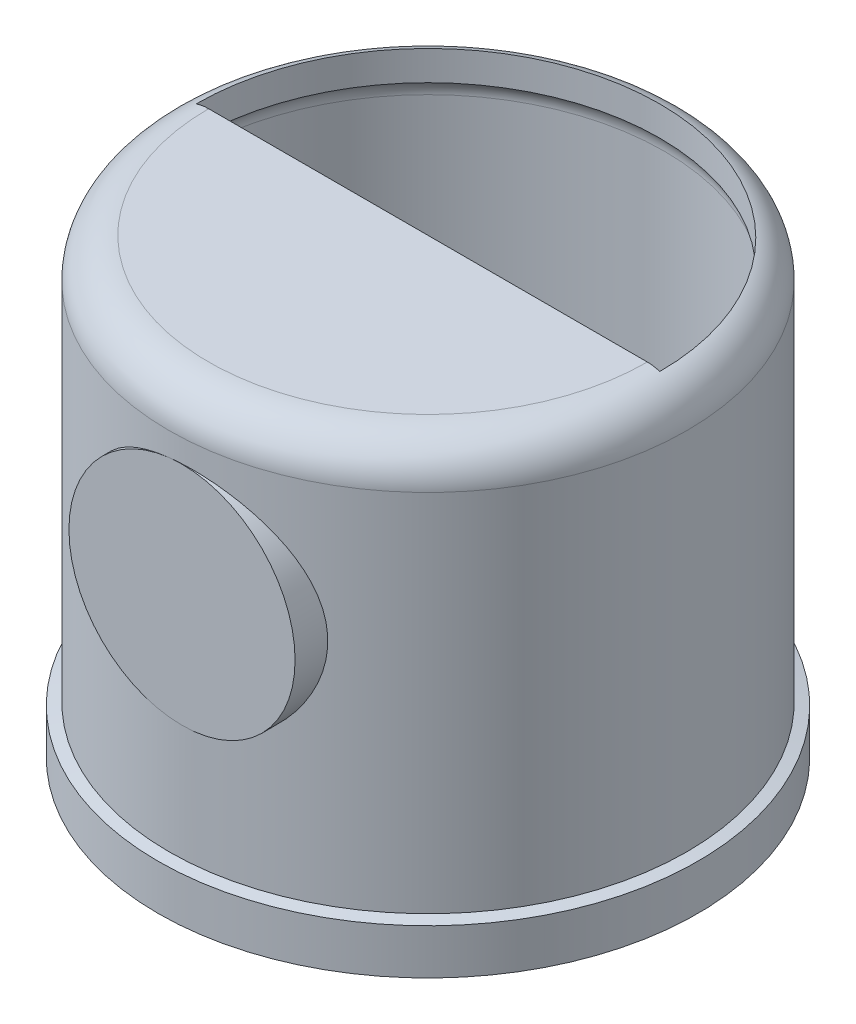
ISO-10303-21;
HEADER;
FILE_DESCRIPTION(('STEP AP214'),'2;1');
FILE_NAME('part.step','',(''),(''),'','','');
FILE_SCHEMA(('AUTOMOTIVE_DESIGN { 1 0 10303 214 1 1 1 1 }'));
ENDSEC;
DATA;
#1=APPLICATION_CONTEXT('core data for automotive mechanical design processes');
#2=APPLICATION_PROTOCOL_DEFINITION('international standard','automotive_design',2000,#1);
#3=PRODUCT_CONTEXT('',#1,'mechanical');
#4=PRODUCT('Part','Part','',(#3));
#5=PRODUCT_RELATED_PRODUCT_CATEGORY('part','',(#4));
#6=PRODUCT_DEFINITION_FORMATION('','',#4);
#7=PRODUCT_DEFINITION_CONTEXT('part definition',#1,'design');
#8=PRODUCT_DEFINITION('design','',#6,#7);
#9=PRODUCT_DEFINITION_SHAPE('','',#8);
#10=(LENGTH_UNIT() NAMED_UNIT(*) SI_UNIT(.MILLI.,.METRE.));
#11=(NAMED_UNIT(*) PLANE_ANGLE_UNIT() SI_UNIT($,.RADIAN.));
#12=(NAMED_UNIT(*) SI_UNIT($,.STERADIAN.) SOLID_ANGLE_UNIT());
#13=UNCERTAINTY_MEASURE_WITH_UNIT(LENGTH_MEASURE(1.E-05),#10,'distance_accuracy_value','');
#14=(GEOMETRIC_REPRESENTATION_CONTEXT(3) GLOBAL_UNCERTAINTY_ASSIGNED_CONTEXT((#13)) GLOBAL_UNIT_ASSIGNED_CONTEXT((#10,
#11,#12)) REPRESENTATION_CONTEXT('',''));
#15=CARTESIAN_POINT('',(0.,0.,0.));
#16=DIRECTION('',(0.,0.,1.));
#17=DIRECTION('',(1.,0.,0.));
#18=AXIS2_PLACEMENT_3D('',#15,#16,#17);
#19=CARTESIAN_POINT('',(0.,36.5,0.));
#20=DIRECTION('',(0.,-1.,0.));
#21=DIRECTION('',(0.,0.,-1.));
#22=AXIS2_PLACEMENT_3D('',#19,#20,#21);
#23=TOROIDAL_SURFACE('',#22,19.4,3.5);
#24=CARTESIAN_POINT('',(-19.4,36.5,0.));
#25=DIRECTION('',(0.,0.,1.));
#26=DIRECTION('',(1.,0.,0.));
#27=AXIS2_PLACEMENT_3D('',#24,#25,#26);
#28=CIRCLE('',#27,3.5);
#29=CARTESIAN_POINT('',(-20.5,39.8226495451672,0.));
#30=VERTEX_POINT('',#29);
#31=CARTESIAN_POINT('',(-19.4,40.,0.));
#32=VERTEX_POINT('',#31);
#33=EDGE_CURVE('E55',#30,#32,#28,.F.);
#34=ORIENTED_EDGE('',*,*,#33,.F.);
#35=CARTESIAN_POINT('',(0.,39.8226495451672,0.));
#36=DIRECTION('',(0.,-1.,0.));
#37=DIRECTION('',(0.,0.,-1.));
#38=AXIS2_PLACEMENT_3D('',#35,#36,#37);
#39=CIRCLE('',#38,20.5);
#40=CARTESIAN_POINT('',(20.5,39.8226495451672,0.));
#41=VERTEX_POINT('',#40);
#42=EDGE_CURVE('E112',#41,#30,#39,.F.);
#43=ORIENTED_EDGE('',*,*,#42,.F.);
#44=CARTESIAN_POINT('',(19.4,36.5,0.));
#45=DIRECTION('',(0.,0.,1.));
#46=DIRECTION('',(1.,0.,0.));
#47=AXIS2_PLACEMENT_3D('',#44,#45,#46);
#48=CIRCLE('',#47,3.5);
#49=CARTESIAN_POINT('',(19.4,40.,0.));
#50=VERTEX_POINT('',#49);
#51=EDGE_CURVE('E100',#50,#41,#48,.F.);
#52=ORIENTED_EDGE('',*,*,#51,.F.);
#53=CARTESIAN_POINT('',(0.,40.,0.));
#54=DIRECTION('',(0.,-1.,0.));
#55=DIRECTION('',(0.,0.,-1.));
#56=AXIS2_PLACEMENT_3D('',#53,#54,#55);
#57=CIRCLE('',#56,19.4);
#58=EDGE_CURVE('E111',#50,#32,#57,.T.);
#59=ORIENTED_EDGE('',*,*,#58,.T.);
#60=EDGE_LOOP('',(#34,#43,#52,#59));
#61=FACE_BOUND('',#60,.T.);
#62=CARTESIAN_POINT('',(0.,36.5,0.));
#63=DIRECTION('',(0.,-1.,0.));
#64=DIRECTION('',(0.,0.,-1.));
#65=AXIS2_PLACEMENT_3D('',#62,#63,#64);
#66=CIRCLE('',#65,22.9);
#67=CARTESIAN_POINT('',(0.,36.5,-22.9));
#68=VERTEX_POINT('',#67);
#69=EDGE_CURVE('E166',#68,#68,#66,.T.);
#70=ORIENTED_EDGE('',*,*,#69,.F.);
#71=EDGE_LOOP('',(#70));
#72=FACE_BOUND('',#71,.T.);
#73=ADVANCED_FACE('F40',(#61,#72),#23,.T.);
#74=CARTESIAN_POINT('',(19.4,40.,0.));
#75=DIRECTION('',(0.,1.,0.));
#76=DIRECTION('',(0.,0.,1.));
#77=AXIS2_PLACEMENT_3D('',#74,#75,#76);
#78=PLANE('',#77);
#79=DIRECTION('',(1.,0.,0.));
#80=VECTOR('',#79,1.);
#81=CARTESIAN_POINT('',(-20.5,40.,0.));
#82=LINE('',#81,#80);
#83=EDGE_CURVE('E97',#32,#50,#82,.T.);
#84=ORIENTED_EDGE('',*,*,#83,.F.);
#85=ORIENTED_EDGE('',*,*,#58,.F.);
#86=EDGE_LOOP('',(#84,#85));
#87=FACE_BOUND('',#86,.T.);
#88=ADVANCED_FACE('F116',(#87),#78,.T.);
#89=CARTESIAN_POINT('',(20.9,11.9081781359912,0.));
#90=DIRECTION('',(0.,-1.,0.));
#91=DIRECTION('',(0.,0.,-1.));
#92=AXIS2_PLACEMENT_3D('',#89,#90,#91);
#93=PLANE('',#92);
#94=CARTESIAN_POINT('',(0.,11.9081781359912,0.));
#95=DIRECTION('',(0.,-1.,0.));
#96=DIRECTION('',(0.,0.,-1.));
#97=AXIS2_PLACEMENT_3D('',#94,#95,#96);
#98=CIRCLE('',#97,20.5);
#99=CARTESIAN_POINT('',(-20.5,11.9081781359912,0.));
#100=VERTEX_POINT('',#99);
#101=CARTESIAN_POINT('',(20.5,11.9081781359912,0.));
#102=VERTEX_POINT('',#101);
#103=EDGE_CURVE('E254',#100,#102,#98,.T.);
#104=ORIENTED_EDGE('',*,*,#103,.F.);
#105=DIRECTION('',(-1.,0.,0.));
#106=VECTOR('',#105,1.);
#107=CARTESIAN_POINT('',(20.9,11.9081781359912,0.));
#108=LINE('',#107,#106);
#109=EDGE_CURVE('E114',#102,#100,#108,.T.);
#110=ORIENTED_EDGE('',*,*,#109,.F.);
#111=EDGE_LOOP('',(#104,#110));
#112=FACE_BOUND('',#111,.T.);
#113=CARTESIAN_POINT('',(0.,11.9081781359912,0.));
#114=DIRECTION('',(0.,-1.,0.));
#115=DIRECTION('',(0.,0.,-1.));
#116=AXIS2_PLACEMENT_3D('',#113,#114,#115);
#117=CIRCLE('',#116,20.9);
#118=CARTESIAN_POINT('',(0.,11.9081781359912,-20.9));
#119=VERTEX_POINT('',#118);
#120=EDGE_CURVE('E186',#119,#119,#117,.T.);
#121=ORIENTED_EDGE('',*,*,#120,.T.);
#122=EDGE_LOOP('',(#121));
#123=FACE_BOUND('',#122,.T.);
#124=ADVANCED_FACE('F215',(#112,#123),#93,.T.);
#125=CARTESIAN_POINT('',(0.,-0.724089275479442,0.));
#126=DIRECTION('',(0.,-1.,0.));
#127=DIRECTION('',(0.,0.,-1.));
#128=AXIS2_PLACEMENT_3D('',#125,#126,#127);
#129=CYLINDRICAL_SURFACE('',#128,20.9);
#130=CARTESIAN_POINT('',(0.,0.,0.));
#131=DIRECTION('',(0.,-1.,0.));
#132=DIRECTION('',(0.,0.,-1.));
#133=AXIS2_PLACEMENT_3D('',#130,#131,#132);
#134=CIRCLE('',#133,20.9);
#135=CARTESIAN_POINT('',(0.,0.,-20.9));
#136=VERTEX_POINT('',#135);
#137=EDGE_CURVE('E182',#136,#136,#134,.T.);
#138=ORIENTED_EDGE('',*,*,#137,.T.);
#139=EDGE_LOOP('',(#138));
#140=FACE_BOUND('',#139,.T.);
#141=ORIENTED_EDGE('',*,*,#120,.F.);
#142=EDGE_LOOP('',(#141));
#143=FACE_BOUND('',#142,.T.);
#144=ADVANCED_FACE('F219',(#140,#143),#129,.F.);
#145=CARTESIAN_POINT('',(20.9,0.,0.));
#146=DIRECTION('',(0.,-1.,0.));
#147=DIRECTION('',(0.,0.,-1.));
#148=AXIS2_PLACEMENT_3D('',#145,#146,#147);
#149=PLANE('',#148);
#150=CARTESIAN_POINT('',(0.,0.,0.));
#151=DIRECTION('',(0.,-1.,0.));
#152=DIRECTION('',(0.,0.,-1.));
#153=AXIS2_PLACEMENT_3D('',#150,#151,#152);
#154=CIRCLE('',#153,23.8715918375041);
#155=CARTESIAN_POINT('',(0.,0.,-23.8715918375041));
#156=VERTEX_POINT('',#155);
#157=EDGE_CURVE('E178',#156,#156,#154,.T.);
#158=ORIENTED_EDGE('',*,*,#157,.T.);
#159=EDGE_LOOP('',(#158));
#160=FACE_BOUND('',#159,.T.);
#161=ORIENTED_EDGE('',*,*,#137,.F.);
#162=EDGE_LOOP('',(#161));
#163=FACE_BOUND('',#162,.T.);
#164=ADVANCED_FACE('F297',(#160,#163),#149,.T.);
#165=CARTESIAN_POINT('',(0.,-0.724089275479442,0.));
#166=DIRECTION('',(0.,-1.,0.));
#167=DIRECTION('',(0.,0.,-1.));
#168=AXIS2_PLACEMENT_3D('',#165,#166,#167);
#169=CYLINDRICAL_SURFACE('',#168,23.8715918375041);
#170=CARTESIAN_POINT('',(0.,4.,0.));
#171=DIRECTION('',(0.,-1.,0.));
#172=DIRECTION('',(0.,0.,-1.));
#173=AXIS2_PLACEMENT_3D('',#170,#171,#172);
#174=CIRCLE('',#173,23.8715918375041);
#175=CARTESIAN_POINT('',(0.,4.,-23.8715918375041));
#176=VERTEX_POINT('',#175);
#177=EDGE_CURVE('E174',#176,#176,#174,.T.);
#178=ORIENTED_EDGE('',*,*,#177,.T.);
#179=EDGE_LOOP('',(#178));
#180=FACE_BOUND('',#179,.T.);
#181=ORIENTED_EDGE('',*,*,#157,.F.);
#182=EDGE_LOOP('',(#181));
#183=FACE_BOUND('',#182,.T.);
#184=ADVANCED_FACE('F292',(#180,#183),#169,.T.);
#185=CARTESIAN_POINT('',(0.,4.,0.));
#186=DIRECTION('',(0.,-1.,0.));
#187=DIRECTION('',(0.,0.,-1.));
#188=AXIS2_PLACEMENT_3D('',#185,#186,#187);
#189=CONICAL_SURFACE('',#188,23.8715918375041,1.33186665186768);
#190=CARTESIAN_POINT('',(0.,4.23666284308145,0.));
#191=DIRECTION('',(0.,-1.,0.));
#192=DIRECTION('',(0.,0.,-1.));
#193=AXIS2_PLACEMENT_3D('',#190,#191,#192);
#194=CIRCLE('',#193,22.9);
#195=CARTESIAN_POINT('',(0.,4.23666284308145,-22.9));
#196=VERTEX_POINT('',#195);
#197=EDGE_CURVE('E170',#196,#196,#194,.T.);
#198=ORIENTED_EDGE('',*,*,#197,.T.);
#199=EDGE_LOOP('',(#198));
#200=FACE_BOUND('',#199,.T.);
#201=ORIENTED_EDGE('',*,*,#177,.F.);
#202=EDGE_LOOP('',(#201));
#203=FACE_BOUND('',#202,.T.);
#204=ADVANCED_FACE('F288',(#200,#203),#189,.T.);
#205=CARTESIAN_POINT('',(0.,-0.724089275479442,0.));
#206=DIRECTION('',(0.,-1.,0.));
#207=DIRECTION('',(0.,0.,-1.));
#208=AXIS2_PLACEMENT_3D('',#205,#206,#207);
#209=CYLINDRICAL_SURFACE('',#208,22.9);
#210=CARTESIAN_POINT('',(11.1446298645785,24.5,20.0051799587393));
#211=CARTESIAN_POINT('',(11.1446277445211,24.7609901690464,20.0051824052752));
#212=CARTESIAN_POINT('',(11.1343963456302,25.0220630439062,20.0108915552293));
#213=CARTESIAN_POINT('',(11.0935934936793,25.54223924978,20.0335396146365));
#214=CARTESIAN_POINT('',(11.0630091209592,25.8013412239737,20.0504856570194));
#215=CARTESIAN_POINT('',(10.9818099909218,26.3160092112228,20.095073877167));
#216=CARTESIAN_POINT('',(10.9311536647032,26.5715667396853,20.1227382498763));
#217=CARTESIAN_POINT('',(10.8104070159934,27.0768725375808,20.1878625789932));
#218=CARTESIAN_POINT('',(10.7403082246235,27.326618223952,20.2253268036801));
#219=CARTESIAN_POINT('',(10.5819026423815,27.817222025643,20.3086505994999));
#220=CARTESIAN_POINT('',(10.493700069966,28.0581220970861,20.3544619561206));
#221=CARTESIAN_POINT('',(10.2996504177269,28.5312537147744,20.4533384685586));
#222=CARTESIAN_POINT('',(10.1937969504418,28.7634820855556,20.5064062490565));
#223=CARTESIAN_POINT('',(9.96537628941012,29.2179538313331,20.6183762342079));
#224=CARTESIAN_POINT('',(9.84281639879485,29.4402015132112,20.6772758864257));
#225=CARTESIAN_POINT('',(9.58179133663133,29.8738592149634,20.7995202088162));
#226=CARTESIAN_POINT('',(9.44332571992444,30.0852689312722,20.8628650033773));
#227=CARTESIAN_POINT('',(9.14016333292685,30.512078171252,20.9975468640248));
#228=CARTESIAN_POINT('',(8.97427161574757,30.7265534903059,21.0691250928046));
#229=CARTESIAN_POINT('',(8.62602631717368,31.1409291354725,21.2140809431241));
#230=CARTESIAN_POINT('',(8.44367688198169,31.3408331097395,21.2874581080826));
#231=CARTESIAN_POINT('',(8.06331262976379,31.7253021039391,21.4344250115112));
#232=CARTESIAN_POINT('',(7.86528878253018,31.9098581543593,21.5080148486363));
#233=CARTESIAN_POINT('',(7.45460216451242,32.262572437536,21.6537847126987));
#234=CARTESIAN_POINT('',(7.24193721877425,32.4307282250072,21.7259645281222));
#235=CARTESIAN_POINT('',(6.78673678556612,32.761447485421,21.8726202445706));
#236=CARTESIAN_POINT('',(6.54315547874084,32.922675406883,21.9468705518435));
#237=CARTESIAN_POINT('',(6.04177866022837,33.2237262116359,22.0901528799861));
#238=CARTESIAN_POINT('',(5.78398882520473,33.3635575602768,22.1591869591063));
#239=CARTESIAN_POINT('',(5.25570003325066,33.6206018607526,22.2903942528852));
#240=CARTESIAN_POINT('',(4.98520194493891,33.7378163556778,22.3525679354873));
#241=CARTESIAN_POINT('',(4.43333132777802,33.9483672767324,22.4685345832508));
#242=CARTESIAN_POINT('',(4.15195966145207,34.0417055923316,22.5223282114458));
#243=CARTESIAN_POINT('',(3.59490182219484,34.1992613183523,22.6177465632866));
#244=CARTESIAN_POINT('',(3.31964605817942,34.2647112622682,22.659848617038));
#245=CARTESIAN_POINT('',(2.76330401954821,34.3721905692311,22.7343990180205));
#246=CARTESIAN_POINT('',(2.48221790128177,34.4142205594778,22.7668476237657));
#247=CARTESIAN_POINT('',(1.91663353976729,34.4742088117513,22.8214195735881));
#248=CARTESIAN_POINT('',(1.63213707750828,34.4921791294193,22.8435480851559));
#249=CARTESIAN_POINT('',(1.06202715601996,34.5037217591204,22.8771417509054));
#250=CARTESIAN_POINT('',(0.776413770939054,34.497295664169,22.8886076012673));
#251=CARTESIAN_POINT('',(0.229859914063764,34.4615241292258,22.9003424755667));
#252=CARTESIAN_POINT('',(-0.0311902465202553,34.4340937120535,22.9014495986756));
#253=CARTESIAN_POINT('',(-0.550203549640618,34.3588178559456,22.8948600916812));
#254=CARTESIAN_POINT('',(-0.808166886708437,34.3109737105223,22.8871640193389));
#255=CARTESIAN_POINT('',(-1.31915931614173,34.195275767694,22.8634041002285));
#256=CARTESIAN_POINT('',(-1.57218850653733,34.1274223682594,22.8473404198816));
#257=CARTESIAN_POINT('',(-2.07159266475475,33.9722903435528,22.8074825320944));
#258=CARTESIAN_POINT('',(-2.31796748431996,33.8850112858849,22.7836881525709));
#259=CARTESIAN_POINT('',(-2.80147122594324,33.6921571891074,22.7292918446205));
#260=CARTESIAN_POINT('',(-3.03863406111506,33.5866590164344,22.69871836921));
#261=CARTESIAN_POINT('',(-3.5034549689152,33.3579022516768,22.6316364842074));
#262=CARTESIAN_POINT('',(-3.73110963730633,33.2346373676499,22.59512597147));
#263=CARTESIAN_POINT('',(-4.17557443367045,32.9712549377966,22.5172265167952));
#264=CARTESIAN_POINT('',(-4.39238429260554,32.8311369741725,22.4758374539161));
#265=CARTESIAN_POINT('',(-4.81404777841174,32.5349581629351,22.3893116991319));
#266=CARTESIAN_POINT('',(-5.01890044497264,32.3788960375695,22.3441747069251));
#267=CARTESIAN_POINT('',(-5.42868009092517,32.0409997279271,22.2482937186586));
#268=CARTESIAN_POINT('',(-5.63272624771951,31.8581456740842,22.1973761935752));
#269=CARTESIAN_POINT('',(-6.0249633729826,31.4765187389043,22.0941384871066));
#270=CARTESIAN_POINT('',(-6.21315376228662,31.2777452765946,22.0418182545765));
#271=CARTESIAN_POINT('',(-6.57270687150072,30.8653421101344,21.9372877834799));
#272=CARTESIAN_POINT('',(-6.74406268105014,30.6517063661788,21.8850775986203));
#273=CARTESIAN_POINT('',(-7.06884854585063,30.2108435494945,21.7823414164984));
#274=CARTESIAN_POINT('',(-7.2222790277907,29.9836168004767,21.7318153791676));
#275=CARTESIAN_POINT('',(-7.51668327700644,29.5063690902399,21.6317988300054));
#276=CARTESIAN_POINT('',(-7.65679319884188,29.2557832034913,21.5824556598315));
#277=CARTESIAN_POINT('',(-7.91523074458894,28.7428025511672,21.4890206360785));
#278=CARTESIAN_POINT('',(-8.03356719602266,28.480412625185,21.4449266569139));
#279=CARTESIAN_POINT('',(-8.24745626338107,27.9455272010351,21.3635803844406));
#280=CARTESIAN_POINT('',(-8.34301346320594,27.6730337487886,21.3263267149943));
#281=CARTESIAN_POINT('',(-8.51040644595413,27.1198771142381,21.2600823537505));
#282=CARTESIAN_POINT('',(-8.58224385269398,26.8392144926134,21.2310910963409));
#283=CARTESIAN_POINT('',(-8.6986004247129,26.2852507959685,21.1836755559937));
#284=CARTESIAN_POINT('',(-8.74424377652652,26.0122227122403,21.1648190795165));
#285=CARTESIAN_POINT('',(-8.81275694669258,25.4628421469245,21.1363833337898));
#286=CARTESIAN_POINT('',(-8.83562745226591,25.1864897659097,21.1268037845888));
#287=CARTESIAN_POINT('',(-8.85832653450985,24.632759640041,21.1172963042208));
#288=CARTESIAN_POINT('',(-8.85816220318086,24.3553822370727,21.1173654024136));
#289=CARTESIAN_POINT('',(-8.83481060673291,23.8017756929748,21.1271456394214));
#290=CARTESIAN_POINT('',(-8.81162408832163,23.5255465148953,21.1368564655142));
#291=CARTESIAN_POINT('',(-8.74457137350766,22.9928853495949,21.1646802481809));
#292=CARTESIAN_POINT('',(-8.70202518627721,22.7362575502454,21.1822558481562));
#293=CARTESIAN_POINT('',(-8.59722358411727,22.2276137636915,21.2250075862501));
#294=CARTESIAN_POINT('',(-8.5349613161298,21.9755994123303,21.2501863669959));
#295=CARTESIAN_POINT('',(-8.39131312244645,21.4779380529347,21.3073186542595));
#296=CARTESIAN_POINT('',(-8.30993121940881,21.2322897175823,21.339270735577));
#297=CARTESIAN_POINT('',(-8.12867521351164,20.7486626953314,21.4089715504602));
#298=CARTESIAN_POINT('',(-8.02879388275917,20.5106870490373,21.4467225487279));
#299=CARTESIAN_POINT('',(-7.80772737526773,20.036139872629,21.528207451263));
#300=CARTESIAN_POINT('',(-7.68595056948554,19.7998707896223,21.5720970566862));
#301=CARTESIAN_POINT('',(-7.42428278331998,19.3382003671058,21.6635462023525));
#302=CARTESIAN_POINT('',(-7.28438378818665,19.1128038970292,21.7111073626005));
#303=CARTESIAN_POINT('',(-6.98737224643551,18.6741342163592,21.8085086707196));
#304=CARTESIAN_POINT('',(-6.83025748640942,18.4608625700047,21.8583491111537));
#305=CARTESIAN_POINT('',(-6.49972381666145,18.0475678897984,21.9589031813285));
#306=CARTESIAN_POINT('',(-6.32630434634715,17.8475453118825,22.0096168410435));
#307=CARTESIAN_POINT('',(-5.95143636270874,17.4483371329927,22.1140418185163));
#308=CARTESIAN_POINT('',(-5.74887646243842,17.2501834664634,22.1677154363765));
#309=CARTESIAN_POINT('',(-5.32741765387536,16.8715783847214,22.2727583309144));
#310=CARTESIAN_POINT('',(-5.10852456000335,16.6911207223863,22.3241284172941));
#311=CARTESIAN_POINT('',(-4.65552124683866,16.3489975215538,22.4229766229538));
#312=CARTESIAN_POINT('',(-4.42140442220444,16.1873402262202,22.470453032352));
#313=CARTESIAN_POINT('',(-3.9395851404263,15.8842165481317,22.559912872869));
#314=CARTESIAN_POINT('',(-3.69188878303707,15.7427412011158,22.6018987420386));
#315=CARTESIAN_POINT('',(-3.18613177721801,15.4819676404776,22.6787023606292));
#316=CARTESIAN_POINT('',(-2.92815098391894,15.3625282367502,22.7135659110879));
#317=CARTESIAN_POINT('',(-2.40210717327647,15.1457723502827,22.7752057581696));
#318=CARTESIAN_POINT('',(-2.1340441207426,15.0484559447677,22.8019820265625));
#319=CARTESIAN_POINT('',(-1.59001516363166,14.8769537722367,22.8463627678783));
#320=CARTESIAN_POINT('',(-1.31405324665244,14.8027565511898,22.8639717854792));
#321=CARTESIAN_POINT('',(-0.75635805305185,14.6781945856537,22.8892073068402));
#322=CARTESIAN_POINT('',(-0.474625185120213,14.6278281595508,22.896834515031));
#323=CARTESIAN_POINT('',(0.0722859715553385,14.554106941895,22.9014025226651));
#324=CARTESIAN_POINT('',(0.337237494026199,14.5291037020605,22.8990561326617));
#325=CARTESIAN_POINT('',(0.868038682636657,14.500293411226,22.8850820522958));
#326=CARTESIAN_POINT('',(1.1338883022049,14.4964852775241,22.8734548360569));
#327=CARTESIAN_POINT('',(1.66445050559519,14.5099948098528,22.8409772386956));
#328=CARTESIAN_POINT('',(1.92916320718279,14.5273102321568,22.820127837296));
#329=CARTESIAN_POINT('',(2.45553149195771,14.5827638683679,22.7695031372511));
#330=CARTESIAN_POINT('',(2.71718706465624,14.6209021536953,22.7397278079911));
#331=CARTESIAN_POINT('',(3.22902866323948,14.7162720832564,22.6726335226335));
#332=CARTESIAN_POINT('',(3.47933734067708,14.7729957227044,22.6355247077284));
#333=CARTESIAN_POINT('',(3.97373691019839,14.9051249798455,22.5539838557736));
#334=CARTESIAN_POINT('',(4.21782796066531,14.9805301211341,22.5095520054813));
#335=CARTESIAN_POINT('',(4.69839188635823,15.1492976590485,22.4141725022691));
#336=CARTESIAN_POINT('',(4.93486492624146,15.2426596672465,22.3632249902986));
#337=CARTESIAN_POINT('',(5.39904694649486,15.4465901596045,22.2557201498885));
#338=CARTESIAN_POINT('',(5.62675252812734,15.557165234353,22.1991606757451));
#339=CARTESIAN_POINT('',(6.08560545212684,15.801818665363,22.0779311614545));
#340=CARTESIAN_POINT('',(6.31613816461629,15.9369097455035,22.0129780243647));
#341=CARTESIAN_POINT('',(6.76496023111327,16.2245565235295,21.879217919525));
#342=CARTESIAN_POINT('',(6.98324531893241,16.3771182513447,21.8104096253922));
#343=CARTESIAN_POINT('',(7.40653101115914,16.6987648815768,21.6703256166735));
#344=CARTESIAN_POINT('',(7.6115281085571,16.8678541166947,21.5990492582616));
#345=CARTESIAN_POINT('',(8.00724491883681,17.2216101708268,21.4554967168331));
#346=CARTESIAN_POINT('',(8.19796377286569,17.4062779254884,21.3832204739816));
#347=CARTESIAN_POINT('',(8.57923375090789,17.8060416905521,21.2332775364616));
#348=CARTESIAN_POINT('',(8.76849053680225,18.0223911031148,21.1556544384514));
#349=CARTESIAN_POINT('',(9.12802306312959,18.471065544664,21.0030315107857));
#350=CARTESIAN_POINT('',(9.29830510375407,18.7033852293607,20.9280308161226));
#351=CARTESIAN_POINT('',(9.6189117548438,19.1830626049239,20.7826261716822));
#352=CARTESIAN_POINT('',(9.76922099590453,19.4304316655885,20.712225782847));
#353=CARTESIAN_POINT('',(10.0485043140751,19.9387379246907,20.5781818627889));
#354=CARTESIAN_POINT('',(10.1774762944744,20.1996764532276,20.5145389958152));
#355=CARTESIAN_POINT('',(10.4114984860904,20.7305999218624,20.3967567454706));
#356=CARTESIAN_POINT('',(10.5167951107533,21.0004545626505,20.3425209552108));
#357=CARTESIAN_POINT('',(10.7039731792944,21.5498955506945,20.244656739209));
#358=CARTESIAN_POINT('',(10.7858674812725,21.8294764588866,20.2010224905704));
#359=CARTESIAN_POINT('',(10.9249942872062,22.3954450182329,20.1261207413414));
#360=CARTESIAN_POINT('',(10.9822988899582,22.6818101357439,20.0948171089339));
#361=CARTESIAN_POINT('',(11.0716772994762,23.259434657659,20.0457127114312));
#362=CARTESIAN_POINT('',(11.1037721616721,23.5506897697581,20.0279006784607));
#363=CARTESIAN_POINT('',(11.1302189113319,23.952242346709,20.0132022938853));
#364=CARTESIAN_POINT('',(11.1356208480716,24.0616949617612,20.0101964875757));
#365=CARTESIAN_POINT('',(11.142826827679,24.2807601837541,20.0061847740899));
#366=CARTESIAN_POINT('',(11.1446307550947,24.3903727957158,20.005178931088));
#367=CARTESIAN_POINT('',(11.1446298645785,24.5,20.0051799587393));
#368=B_SPLINE_CURVE_WITH_KNOTS('',3,(#210,#211,#212,#213,#214,#215,#216,#217,#218,#219,#220,
#221,#222,#223,#224,#225,#226,#227,#228,#229,#230,#231,#232,#233,#234,#235,#236,#237,#238,#239,
#240,#241,#242,#243,#244,#245,#246,#247,#248,#249,#250,#251,#252,#253,#254,#255,#256,#257,#258,
#259,#260,#261,#262,#263,#264,#265,#266,#267,#268,#269,#270,#271,#272,#273,#274,#275,#276,#277,
#278,#279,#280,#281,#282,#283,#284,#285,#286,#287,#288,#289,#290,#291,#292,#293,#294,#295,#296,
#297,#298,#299,#300,#301,#302,#303,#304,#305,#306,#307,#308,#309,#310,#311,#312,#313,#314,#315,
#316,#317,#318,#319,#320,#321,#322,#323,#324,#325,#326,#327,#328,#329,#330,#331,#332,#333,#334,
#335,#336,#337,#338,#339,#340,#341,#342,#343,#344,#345,#346,#347,#348,#349,#350,#351,#352,#353,
#354,#355,#356,#357,#358,#359,#360,#361,#362,#363,#364,#365,#366,#367),.UNSPECIFIED.,.T.,.F.,(4,
2,2,2,2,2,2,2,2,2,2,2,2,2,2,2,2,2,2,2,2,2,2,2,2,2,2,2,2,2,2,2,2,2,2,2,2,2,2,2,2,2,2,2,2,2,2,2,2,
2,2,2,2,2,2,2,2,2,2,2,2,2,2,2,2,2,2,2,2,2,2,2,2,2,2,2,2,2,4),(0.,0.782853371863684,
1.56620415799369,2.35118581021928,3.13650992843717,3.91743394254665,4.69864117122472,
5.47950798765304,6.26039666377767,7.10080814363015,7.94100848599341,8.78169645057313,
9.62250957102901,10.5255676615734,11.4282675368108,12.330905801344,13.233472612417,
14.09046145755,14.947427350927,15.8039636813221,16.66044408332,17.4469636557941,18.233433397995,
19.0198874989038,19.8063591072549,20.5895902257896,21.3730994041688,22.156628010204,
22.9402194569236,23.7753354768278,24.6104819878612,25.4459698949615,26.2814379103108,
27.1542661039175,28.0267396471375,28.8990374728176,29.7712755700911,30.6025643580955,
31.433828059366,32.2648358304736,33.0958166493363,33.8770889238547,34.6586330572751,
35.4400129054504,36.221698692257,37.0290406910539,37.8367409731751,38.6445452223779,
39.4523772558618,40.3165677421142,41.180452041317,42.0447137003992,42.9085902751392,
43.7667234088129,44.6248595379374,45.4825698387297,46.3402196063944,47.1376434645909,
47.9350265878987,48.732325021207,49.5296261891886,50.3067355053317,51.0838250061329,
51.8608976994786,52.6382686557873,53.4623272643386,54.2866711558217,55.1112317323597,
55.9358418673873,56.8280225705364,57.7199061543321,58.6124721312862,59.5051257644001,
60.3880076269421,61.2704034647948,62.1501940752412,63.0292490920329,63.3580709520086,
63.6869033629588),.UNSPECIFIED.);
#369=CARTESIAN_POINT('',(0.,34.4342751357668,22.9000000000001));
#370=VERTEX_POINT('',#369);
#371=CARTESIAN_POINT('',(0.,14.5657248642331,22.9000000000001));
#372=VERTEX_POINT('',#371);
#373=EDGE_CURVE('E162',#370,#372,#368,.T.);
#374=ORIENTED_EDGE('',*,*,#373,.F.);
#375=EDGE_CURVE('E154',#372,#370,#368,.T.);
#376=ORIENTED_EDGE('',*,*,#375,.F.);
#377=EDGE_LOOP('',(#374,#376));
#378=FACE_BOUND('',#377,.T.);
#379=ORIENTED_EDGE('',*,*,#69,.T.);
#380=EDGE_LOOP('',(#379));
#381=FACE_BOUND('',#380,.T.);
#382=ORIENTED_EDGE('',*,*,#197,.F.);
#383=EDGE_LOOP('',(#382));
#384=FACE_BOUND('',#383,.T.);
#385=ADVANCED_FACE('F149',(#378,#381,#384),#209,.T.);
#386=CARTESIAN_POINT('',(1.14462986457853,24.5,22.9000000000001));
#387=DIRECTION('',(0.,0.,1.));
#388=DIRECTION('',(1.,0.,0.));
#389=AXIS2_PLACEMENT_3D('',#386,#387,#388);
#390=PLANE('',#389);
#391=CARTESIAN_POINT('',(1.14462986457853,24.5,22.9000000000001));
#392=DIRECTION('',(0.,0.,1.));
#393=DIRECTION('',(1.,0.,0.));
#394=AXIS2_PLACEMENT_3D('',#391,#392,#393);
#395=CIRCLE('',#394,10.);
#396=EDGE_CURVE('E258',#372,#370,#395,.T.);
#397=ORIENTED_EDGE('',*,*,#396,.T.);
#398=EDGE_CURVE('E164',#370,#372,#395,.T.);
#399=ORIENTED_EDGE('',*,*,#398,.T.);
#400=EDGE_LOOP('',(#397,#399));
#401=FACE_BOUND('',#400,.T.);
#402=ADVANCED_FACE('F147',(#401),#390,.T.);
#403=CARTESIAN_POINT('',(1.14462986457853,24.5,16.9000000000001));
#404=DIRECTION('',(0.,0.,1.));
#405=DIRECTION('',(1.,0.,0.));
#406=AXIS2_PLACEMENT_3D('',#403,#404,#405);
#407=CYLINDRICAL_SURFACE('',#406,10.);
#408=ORIENTED_EDGE('',*,*,#398,.F.);
#409=ORIENTED_EDGE('',*,*,#373,.T.);
#410=EDGE_LOOP('',(#408,#409));
#411=FACE_BOUND('',#410,.T.);
#412=ADVANCED_FACE('F145',(#411),#407,.T.);
#413=ORIENTED_EDGE('',*,*,#396,.F.);
#414=ORIENTED_EDGE('',*,*,#375,.T.);
#415=EDGE_LOOP('',(#413,#414));
#416=FACE_BOUND('',#415,.T.);
#417=ADVANCED_FACE('F146',(#416),#407,.T.);
#418=CARTESIAN_POINT('',(-20.5,10.,0.));
#419=DIRECTION('',(0.,0.,1.));
#420=DIRECTION('',(1.,0.,0.));
#421=AXIS2_PLACEMENT_3D('',#418,#419,#420);
#422=PLANE('',#421);
#423=ORIENTED_EDGE('',*,*,#109,.T.);
#424=DIRECTION('',(0.,1.,0.));
#425=VECTOR('',#424,1.);
#426=CARTESIAN_POINT('',(-20.5,10.,0.));
#427=LINE('',#426,#425);
#428=CARTESIAN_POINT('',(-20.5,13.9081781359912,0.));
#429=VERTEX_POINT('',#428);
#430=EDGE_CURVE('E427',#100,#429,#427,.T.);
#431=ORIENTED_EDGE('',*,*,#430,.T.);
#432=DIRECTION('',(1.,0.,0.));
#433=VECTOR('',#432,1.);
#434=CARTESIAN_POINT('',(20.9,13.9081781359912,0.));
#435=LINE('',#434,#433);
#436=CARTESIAN_POINT('',(20.5,13.9081781359912,0.));
#437=VERTEX_POINT('',#436);
#438=EDGE_CURVE('E48',#429,#437,#435,.T.);
#439=ORIENTED_EDGE('',*,*,#438,.T.);
#440=DIRECTION('',(0.,1.,0.));
#441=VECTOR('',#440,1.);
#442=CARTESIAN_POINT('',(20.5,10.,0.));
#443=LINE('',#442,#441);
#444=EDGE_CURVE('E63',#102,#437,#443,.T.);
#445=ORIENTED_EDGE('',*,*,#444,.F.);
#446=EDGE_LOOP('',(#423,#431,#439,#445));
#447=FACE_BOUND('',#446,.T.);
#448=ADVANCED_FACE('F230',(#447),#422,.F.);
#449=CARTESIAN_POINT('',(0.,10.,0.));
#450=DIRECTION('',(0.,1.,0.));
#451=DIRECTION('',(0.,0.,1.));
#452=AXIS2_PLACEMENT_3D('',#449,#450,#451);
#453=CYLINDRICAL_SURFACE('',#452,20.5);
#454=ORIENTED_EDGE('',*,*,#103,.T.);
#455=ORIENTED_EDGE('',*,*,#444,.T.);
#456=CARTESIAN_POINT('',(0.,13.9081781359912,0.));
#457=DIRECTION('',(0.,1.,0.));
#458=DIRECTION('',(0.,0.,1.));
#459=AXIS2_PLACEMENT_3D('',#456,#457,#458);
#460=CIRCLE('',#459,20.5);
#461=EDGE_CURVE('E11',#437,#429,#460,.T.);
#462=ORIENTED_EDGE('',*,*,#461,.T.);
#463=ORIENTED_EDGE('',*,*,#430,.F.);
#464=EDGE_LOOP('',(#454,#455,#462,#463));
#465=FACE_BOUND('',#464,.T.);
#466=ADVANCED_FACE('F281',(#465),#453,.F.);
#467=ORIENTED_EDGE('',*,*,#42,.T.);
#468=CARTESIAN_POINT('',(-20.5,37.2,0.));
#469=VERTEX_POINT('',#468);
#470=EDGE_CURVE('E106',#469,#30,#427,.T.);
#471=ORIENTED_EDGE('',*,*,#470,.F.);
#472=CARTESIAN_POINT('',(0.,37.2,0.));
#473=DIRECTION('',(0.,-1.,0.));
#474=DIRECTION('',(0.,0.,-1.));
#475=AXIS2_PLACEMENT_3D('',#472,#473,#474);
#476=CIRCLE('',#475,20.5);
#477=CARTESIAN_POINT('',(20.5,37.2,0.));
#478=VERTEX_POINT('',#477);
#479=EDGE_CURVE('E242',#469,#478,#476,.T.);
#480=ORIENTED_EDGE('',*,*,#479,.T.);
#481=EDGE_CURVE('E425',#478,#41,#443,.T.);
#482=ORIENTED_EDGE('',*,*,#481,.T.);
#483=EDGE_LOOP('',(#467,#471,#480,#482));
#484=FACE_BOUND('',#483,.T.);
#485=ADVANCED_FACE('F228',(#484),#453,.F.);
#486=ORIENTED_EDGE('',*,*,#33,.T.);
#487=ORIENTED_EDGE('',*,*,#83,.T.);
#488=ORIENTED_EDGE('',*,*,#51,.T.);
#489=ORIENTED_EDGE('',*,*,#481,.F.);
#490=CARTESIAN_POINT('',(18.9,36.,0.));
#491=DIRECTION('',(0.,0.,1.));
#492=DIRECTION('',(1.,0.,0.));
#493=AXIS2_PLACEMENT_3D('',#490,#491,#492);
#494=CIRCLE('',#493,2.);
#495=CARTESIAN_POINT('',(18.9,38.,0.));
#496=VERTEX_POINT('',#495);
#497=EDGE_CURVE('E237',#478,#496,#494,.T.);
#498=ORIENTED_EDGE('',*,*,#497,.T.);
#499=DIRECTION('',(-1.,0.,0.));
#500=VECTOR('',#499,1.);
#501=CARTESIAN_POINT('',(18.9,38.,0.));
#502=LINE('',#501,#500);
#503=CARTESIAN_POINT('',(-18.9,38.,0.));
#504=VERTEX_POINT('',#503);
#505=EDGE_CURVE('E232',#496,#504,#502,.T.);
#506=ORIENTED_EDGE('',*,*,#505,.T.);
#507=CARTESIAN_POINT('',(-18.9,36.,0.));
#508=DIRECTION('',(0.,0.,1.));
#509=DIRECTION('',(1.,0.,0.));
#510=AXIS2_PLACEMENT_3D('',#507,#508,#509);
#511=CIRCLE('',#510,2.);
#512=EDGE_CURVE('E236',#504,#469,#511,.T.);
#513=ORIENTED_EDGE('',*,*,#512,.T.);
#514=ORIENTED_EDGE('',*,*,#470,.T.);
#515=EDGE_LOOP('',(#486,#487,#488,#489,#498,#506,#513,#514));
#516=FACE_BOUND('',#515,.T.);
#517=ADVANCED_FACE('F99',(#516),#422,.F.);
#518=CARTESIAN_POINT('',(18.9,38.,0.));
#519=DIRECTION('',(0.,-1.,0.));
#520=DIRECTION('',(0.,0.,-1.));
#521=AXIS2_PLACEMENT_3D('',#518,#519,#520);
#522=PLANE('',#521);
#523=ORIENTED_EDGE('',*,*,#505,.F.);
#524=CARTESIAN_POINT('',(0.,38.,0.));
#525=DIRECTION('',(0.,-1.,0.));
#526=DIRECTION('',(0.,0.,-1.));
#527=AXIS2_PLACEMENT_3D('',#524,#525,#526);
#528=CIRCLE('',#527,18.9);
#529=EDGE_CURVE('E119',#496,#504,#528,.T.);
#530=ORIENTED_EDGE('',*,*,#529,.T.);
#531=EDGE_LOOP('',(#523,#530));
#532=FACE_BOUND('',#531,.T.);
#533=ADVANCED_FACE('F207',(#532),#522,.T.);
#534=CARTESIAN_POINT('',(0.,36.,0.));
#535=DIRECTION('',(0.,-1.,0.));
#536=DIRECTION('',(0.,0.,-1.));
#537=AXIS2_PLACEMENT_3D('',#534,#535,#536);
#538=TOROIDAL_SURFACE('',#537,18.9,2.);
#539=ORIENTED_EDGE('',*,*,#512,.F.);
#540=ORIENTED_EDGE('',*,*,#529,.F.);
#541=ORIENTED_EDGE('',*,*,#497,.F.);
#542=ORIENTED_EDGE('',*,*,#479,.F.);
#543=EDGE_LOOP('',(#539,#540,#541,#542));
#544=FACE_BOUND('',#543,.T.);
#545=CARTESIAN_POINT('',(0.,36.,0.));
#546=DIRECTION('',(0.,-1.,0.));
#547=DIRECTION('',(0.,0.,-1.));
#548=AXIS2_PLACEMENT_3D('',#545,#546,#547);
#549=CIRCLE('',#548,20.9);
#550=CARTESIAN_POINT('',(0.,36.,-20.9));
#551=VERTEX_POINT('',#550);
#552=EDGE_CURVE('E126',#551,#551,#549,.T.);
#553=ORIENTED_EDGE('',*,*,#552,.T.);
#554=EDGE_LOOP('',(#553));
#555=FACE_BOUND('',#554,.T.);
#556=ADVANCED_FACE('F197',(#544,#555),#538,.F.);
#557=CARTESIAN_POINT('',(0.,-0.724089275479442,0.));
#558=DIRECTION('',(0.,-1.,0.));
#559=DIRECTION('',(0.,0.,-1.));
#560=AXIS2_PLACEMENT_3D('',#557,#558,#559);
#561=CYLINDRICAL_SURFACE('',#560,20.9);
#562=CARTESIAN_POINT('',(11.1446298645785,24.5,17.6807020556748));
#563=CARTESIAN_POINT('',(11.1446279091429,24.2430416195614,17.6807046012758));
#564=CARTESIAN_POINT('',(11.1347102540173,23.9860363196105,17.6869666825429));
#565=CARTESIAN_POINT('',(11.0951769841968,23.4740368662757,17.711791959631));
#566=CARTESIAN_POINT('',(11.0655506369154,23.2190438853204,17.7303618577895));
#567=CARTESIAN_POINT('',(10.9869561232709,22.712720954057,17.7791713069156));
#568=CARTESIAN_POINT('',(10.9379529347466,22.4613984955785,17.8094319857888));
#569=CARTESIAN_POINT('',(10.8212398191909,21.9645761400012,17.8805880578735));
#570=CARTESIAN_POINT('',(10.75352156098,21.7190788890185,17.9214881868531));
#571=CARTESIAN_POINT('',(10.6006852371521,21.2370981632122,18.0123100051586));
#572=CARTESIAN_POINT('',(10.5156821446994,21.000566786143,18.0621718419379));
#573=CARTESIAN_POINT('',(10.3288243885498,20.536001291917,18.1696725409938));
#574=CARTESIAN_POINT('',(10.2269635401265,20.307970331129,18.2273142560934));
#575=CARTESIAN_POINT('',(10.0072932167038,19.8615663922329,18.348837174927));
#576=CARTESIAN_POINT('',(9.88948871362381,19.6431904313326,18.4127164318035));
#577=CARTESIAN_POINT('',(9.6387146482511,19.2168479105328,18.5452228162005));
#578=CARTESIAN_POINT('',(9.5057446482219,19.0088816513482,18.6138500807447));
#579=CARTESIAN_POINT('',(9.21246913719604,18.5854187726459,18.7608563376559));
#580=CARTESIAN_POINT('',(9.05077385735853,18.3709934680642,18.8395512638532));
#581=CARTESIAN_POINT('',(8.7110971331717,17.9562680451089,18.998999698316));
#582=CARTESIAN_POINT('',(8.53311465493874,17.7559688248661,19.0797533370301));
#583=CARTESIAN_POINT('',(8.16159015605921,17.3702014217364,19.2416092608204));
#584=CARTESIAN_POINT('',(7.96803684795298,17.1847441958133,19.3227117577342));
#585=CARTESIAN_POINT('',(7.56640728714962,16.829759814457,19.4834867860091));
#586=CARTESIAN_POINT('',(7.35833576404402,16.6602275130062,19.563159772526));
#587=CARTESIAN_POINT('',(6.90855062114976,16.3229975976939,19.7267422204671));
#588=CARTESIAN_POINT('',(6.66550644965115,16.1569272481059,19.8103596396676));
#589=CARTESIAN_POINT('',(6.16433253336525,15.8461262910426,19.9719886026049));
#590=CARTESIAN_POINT('',(5.90620170167332,15.7013972237332,20.0499997415374));
#591=CARTESIAN_POINT('',(5.37645783304004,15.4347073447709,20.198498290586));
#592=CARTESIAN_POINT('',(5.10484934139268,15.312738922349,20.2689882122797));
#593=CARTESIAN_POINT('',(4.54988478757333,15.0929128268936,20.4007315913442));
#594=CARTESIAN_POINT('',(4.26652986730713,14.9950528165999,20.4619859438607));
#595=CARTESIAN_POINT('',(3.70705328924623,14.8297346688796,20.5704678529385));
#596=CARTESIAN_POINT('',(3.43147625770881,14.7608343430173,20.6183058353274));
#597=CARTESIAN_POINT('',(2.87387195897784,14.6465386442152,20.7033904496491));
#598=CARTESIAN_POINT('',(2.59184488893616,14.6011425538451,20.740637404841));
#599=CARTESIAN_POINT('',(2.02385475410009,14.5346263408936,20.8037402760952));
#600=CARTESIAN_POINT('',(1.73789426166488,14.5134910511661,20.8296033028154));
#601=CARTESIAN_POINT('',(1.16440072316068,14.4959064622009,20.8695175970932));
#602=CARTESIAN_POINT('',(0.876867810035494,14.4994551072876,20.8835698481419));
#603=CARTESIAN_POINT('',(0.330930936852656,14.5297856049638,20.8989863324679));
#604=CARTESIAN_POINT('',(0.0724267321390121,14.5542627553172,20.9014564449279));
#605=CARTESIAN_POINT('',(-0.441796994474041,14.6232326963174,20.8969115329168));
#606=CARTESIAN_POINT('',(-0.697516728479499,14.6677239513169,20.889897236085));
#607=CARTESIAN_POINT('',(-1.20431899309289,14.776337847613,20.8668150497608));
#608=CARTESIAN_POINT('',(-1.45540165122598,14.8404599481827,20.8507474096303));
#609=CARTESIAN_POINT('',(-1.95121360132696,14.9877637075943,20.8102052021575));
#610=CARTESIAN_POINT('',(-2.19594274106809,15.0709458226351,20.7857304335847));
#611=CARTESIAN_POINT('',(-2.67540385964988,15.2548548169503,20.729447350241));
#612=CARTESIAN_POINT('',(-2.91020345452832,15.3554255077104,20.6977035673108));
#613=CARTESIAN_POINT('',(-3.37071792000166,15.5738247607182,20.6277126641047));
#614=CARTESIAN_POINT('',(-3.59642956164059,15.6916593890667,20.5894632571575));
#615=CARTESIAN_POINT('',(-4.03748237695515,15.9437022889081,20.507536493875));
#616=CARTESIAN_POINT('',(-4.25282331604549,16.0779109305388,20.4638590148365));
#617=CARTESIAN_POINT('',(-4.67208429326401,16.3618218341117,20.372228263065));
#618=CARTESIAN_POINT('',(-4.87600352537031,16.5115251873873,20.3242746891884));
#619=CARTESIAN_POINT('',(-5.28634561171029,16.8373471740138,20.2215869294342));
#620=CARTESIAN_POINT('',(-5.49180457531716,17.0146055181217,20.1666140055175));
#621=CARTESIAN_POINT('',(-5.88737465257279,17.384922692303,20.0547022347687));
#622=CARTESIAN_POINT('',(-6.07748514509139,17.5779821611888,19.9977633085083));
#623=CARTESIAN_POINT('',(-6.44146339426939,17.9789167124662,19.8835095845199));
#624=CARTESIAN_POINT('',(-6.61532366393618,18.186798546993,19.82619462643));
#625=CARTESIAN_POINT('',(-6.94577987046139,18.6162352558116,19.7128553233762));
#626=CARTESIAN_POINT('',(-7.10237347204007,18.837791973297,19.6568311537973));
#627=CARTESIAN_POINT('',(-7.40601498426782,19.3068283042302,19.5445304390357));
#628=CARTESIAN_POINT('',(-7.55196054982998,19.5550661665437,19.48843267404));
#629=CARTESIAN_POINT('',(-7.82224871984756,20.0640030190874,19.3815260258919));
#630=CARTESIAN_POINT('',(-7.94660008309485,20.3246969020807,19.3307150017604));
#631=CARTESIAN_POINT('',(-8.1726403600522,20.8569195427546,19.2362409000247));
#632=CARTESIAN_POINT('',(-8.27433499599231,21.12844554418,19.1925760183171));
#633=CARTESIAN_POINT('',(-8.45404102406455,21.6804696951827,19.1141001065524));
#634=CARTESIAN_POINT('',(-8.53205433200985,21.9609671169441,19.0792883603161));
#635=CARTESIAN_POINT('',(-8.6601997402689,22.5145626049831,19.0214519557537));
#636=CARTESIAN_POINT('',(-8.71152925963457,22.7873310469167,18.9979256375778));
#637=CARTESIAN_POINT('',(-8.79137650356131,23.3368759973624,18.9611087264943));
#638=CARTESIAN_POINT('',(-8.81989497264973,23.6136523747598,18.9478177995155));
#639=CARTESIAN_POINT('',(-8.85375082882029,24.1688079799249,18.932021747164));
#640=CARTESIAN_POINT('',(-8.85909821510427,24.44718646438,18.9295119693202));
#641=CARTESIAN_POINT('',(-8.84656802665163,25.0032970742355,18.9353712730681));
#642=CARTESIAN_POINT('',(-8.8286915597932,25.2810292298353,18.9437398357159));
#643=CARTESIAN_POINT('',(-8.77222707663324,25.8121175908427,18.9699473148045));
#644=CARTESIAN_POINT('',(-8.73534902700931,26.065696827364,18.9870031839175));
#645=CARTESIAN_POINT('',(-8.64240063235686,26.5686864377694,19.0294908258553));
#646=CARTESIAN_POINT('',(-8.5863237061957,26.8180953513307,19.0549254707054));
#647=CARTESIAN_POINT('',(-8.45553768354077,27.3110133710801,19.1133199746498));
#648=CARTESIAN_POINT('',(-8.38083209549481,27.554523578743,19.1462784166436));
#649=CARTESIAN_POINT('',(-8.21340578687101,28.0343699528198,19.2186960927477));
#650=CARTESIAN_POINT('',(-8.12067797541487,28.2707032530086,19.2581578846812));
#651=CARTESIAN_POINT('',(-7.91458744257154,28.7425263322095,19.3437886432258));
#652=CARTESIAN_POINT('',(-7.80064369061639,28.9777297065286,19.3901362720063));
#653=CARTESIAN_POINT('',(-7.5550833575314,29.437919057496,19.4871276083371));
#654=CARTESIAN_POINT('',(-7.42345905002596,29.6629005093318,19.5377731905032));
#655=CARTESIAN_POINT('',(-7.14337768872811,30.1014857651557,19.6419060760835));
#656=CARTESIAN_POINT('',(-6.99491783943234,30.3150876709158,19.6953938506514));
#657=CARTESIAN_POINT('',(-6.68200446211572,30.7298710821492,19.8037428026959));
#658=CARTESIAN_POINT('',(-6.5175501944289,30.9310520125071,19.8586040436016));
#659=CARTESIAN_POINT('',(-6.15848574453727,31.3369710294209,19.9730210565627));
#660=CARTESIAN_POINT('',(-5.96249665452715,31.5404938437902,20.0325696984982));
#661=CARTESIAN_POINT('',(-5.55376853719182,31.9304246366215,20.1497104265007));
#662=CARTESIAN_POINT('',(-5.34103522197295,32.1168384050412,20.2073031702854));
#663=CARTESIAN_POINT('',(-4.89981829870072,32.4714989650002,20.3187985320932));
#664=CARTESIAN_POINT('',(-4.67132650063269,32.6397361914493,20.3726992018186));
#665=CARTESIAN_POINT('',(-4.2001157965001,32.9566107048243,20.4750364954157));
#666=CARTESIAN_POINT('',(-3.95740330175594,33.1052567275942,20.5234755532534));
#667=CARTESIAN_POINT('',(-3.45891452777884,33.3819318491734,20.6133477306577));
#668=CARTESIAN_POINT('',(-3.20312534147726,33.5099400393991,20.6547737472772));
#669=CARTESIAN_POINT('',(-2.68045607062268,33.7439545499651,20.7290814352351));
#670=CARTESIAN_POINT('',(-2.41357586359017,33.8499606272558,20.7619630121872));
#671=CARTESIAN_POINT('',(-1.87091178436445,34.0388150201296,20.8178778440802));
#672=CARTESIAN_POINT('',(-1.59513342588957,34.1216773805227,20.8409170763824));
#673=CARTESIAN_POINT('',(-1.03680594593341,34.2634148145675,20.8761405277794));
#674=CARTESIAN_POINT('',(-0.754257435276788,34.3222920436699,20.8883257224012));
#675=CARTESIAN_POINT('',(-0.208136710865089,34.4116203613972,20.9006002424078));
#676=CARTESIAN_POINT('',(0.0551015415057397,34.443999720891,20.9015958498858));
#677=CARTESIAN_POINT('',(0.583158286675202,34.4877387714805,20.8935309520948));
#678=CARTESIAN_POINT('',(0.847976685319654,34.4990997026718,20.8844710401558));
#679=CARTESIAN_POINT('',(1.37709700428843,34.5007973009931,20.8562650227775));
#680=CARTESIAN_POINT('',(1.64139899718885,34.4911371727007,20.8371204550412));
#681=CARTESIAN_POINT('',(2.16751303724601,34.4510456785098,20.788979399665));
#682=CARTESIAN_POINT('',(2.42932509262287,34.4206143812084,20.7599829445611));
#683=CARTESIAN_POINT('',(2.93866335898046,34.3410031777209,20.6939046631949));
#684=CARTESIAN_POINT('',(3.18635412831771,34.2925805870793,20.6571724041344));
#685=CARTESIAN_POINT('',(3.67610496839552,34.1775464680933,20.5756622685614));
#686=CARTESIAN_POINT('',(3.91816523885736,34.1109355859827,20.5308846779206));
#687=CARTESIAN_POINT('',(4.39526228613837,33.9602311947679,20.434062811275));
#688=CARTESIAN_POINT('',(4.63029938356961,33.8761384851186,20.3820188676008));
#689=CARTESIAN_POINT('',(5.092234092691,33.6912103136511,20.2715460784072));
#690=CARTESIAN_POINT('',(5.31912854160137,33.5903684298851,20.2131147868078));
#691=CARTESIAN_POINT('',(5.77739397050603,33.3660331171361,20.0871009816842));
#692=CARTESIAN_POINT('',(6.00817374390596,33.2415244041843,20.0191759802578));
#693=CARTESIAN_POINT('',(6.4582621430533,32.9754754932274,19.8785429556874));
#694=CARTESIAN_POINT('',(6.67756679031269,32.833929443689,19.8058332931435));
#695=CARTESIAN_POINT('',(7.10375540015218,32.5347143728201,19.6569993310884));
#696=CARTESIAN_POINT('',(7.31063570702505,32.3770406426532,19.5808740379704));
#697=CARTESIAN_POINT('',(7.71107919388715,32.0464669123876,19.4266647390194));
#698=CARTESIAN_POINT('',(7.90464152283831,31.8735659408528,19.3485806084481));
#699=CARTESIAN_POINT('',(8.29656732934895,31.4950930375005,19.1840192266102));
#700=CARTESIAN_POINT('',(8.49343084108479,31.2879857967001,19.0974930371915));
#701=CARTESIAN_POINT('',(8.86895251570466,30.8573914938457,18.9260213212994));
#702=CARTESIAN_POINT('',(9.04761616115715,30.6339093996753,18.8410753251454));
#703=CARTESIAN_POINT('',(9.38590206062907,30.1712978323407,18.6748600358276));
#704=CARTESIAN_POINT('',(9.545505371028,29.9321531519616,18.5935944495082));
#705=CARTESIAN_POINT('',(9.84431229702477,29.4394869390908,18.4371356379174));
#706=CARTESIAN_POINT('',(9.9835132557547,29.185963540102,18.3619432040852));
#707=CARTESIAN_POINT('',(10.2415051001894,28.6632494587883,18.2193175033698));
#708=CARTESIAN_POINT('',(10.3600775235498,28.3939272543659,18.1519695237355));
#709=CARTESIAN_POINT('',(10.5736381034555,27.8437701924383,18.0284056824395));
#710=CARTESIAN_POINT('',(10.6686398947249,27.562942100722,17.9721833888149));
#711=CARTESIAN_POINT('',(10.8335232013297,26.9926267305744,17.8732763260297));
#712=CARTESIAN_POINT('',(10.9034812820679,26.7031688272161,17.8305503429313));
#713=CARTESIAN_POINT('',(11.0174419947496,26.1175361513616,17.760363142642));
#714=CARTESIAN_POINT('',(11.0614661477993,25.8213671605941,17.7328892696776));
#715=CARTESIAN_POINT('',(11.1095920772399,25.3536356282384,17.7027494851221));
#716=CARTESIAN_POINT('',(11.1227211438815,25.1833006871329,17.6944956491643));
#717=CARTESIAN_POINT('',(11.1402410724924,24.8419841275141,17.6834708462863));
#718=CARTESIAN_POINT('',(11.1446311658954,24.6710024534474,17.6807003616106));
#719=CARTESIAN_POINT('',(11.1446298645785,24.5,17.6807020556748));
#720=B_SPLINE_CURVE_WITH_KNOTS('',3,(#562,#563,#564,#565,#566,#567,#568,#569,#570,#571,#572,
#573,#574,#575,#576,#577,#578,#579,#580,#581,#582,#583,#584,#585,#586,#587,#588,#589,#590,#591,
#592,#593,#594,#595,#596,#597,#598,#599,#600,#601,#602,#603,#604,#605,#606,#607,#608,#609,#610,
#611,#612,#613,#614,#615,#616,#617,#618,#619,#620,#621,#622,#623,#624,#625,#626,#627,#628,#629,
#630,#631,#632,#633,#634,#635,#636,#637,#638,#639,#640,#641,#642,#643,#644,#645,#646,#647,#648,
#649,#650,#651,#652,#653,#654,#655,#656,#657,#658,#659,#660,#661,#662,#663,#664,#665,#666,#667,
#668,#669,#670,#671,#672,#673,#674,#675,#676,#677,#678,#679,#680,#681,#682,#683,#684,#685,#686,
#687,#688,#689,#690,#691,#692,#693,#694,#695,#696,#697,#698,#699,#700,#701,#702,#703,#704,#705,
#706,#707,#708,#709,#710,#711,#712,#713,#714,#715,#716,#717,#718,#719),.UNSPECIFIED.,.T.,.F.,(4,
2,2,2,2,2,2,2,2,2,2,2,2,2,2,2,2,2,2,2,2,2,2,2,2,2,2,2,2,2,2,2,2,2,2,2,2,2,2,2,2,2,2,2,2,2,2,2,2,
2,2,2,2,2,2,2,2,2,2,2,2,2,2,2,2,2,2,2,2,2,2,2,2,2,2,2,2,2,4),(0.,0.770691847061993,
1.54180372682815,2.31431575017263,3.0871722195688,3.85504684558348,4.62320381435778,
5.3911217882374,6.159061932894,6.99774947356456,7.83649028967274,8.67584469355845,
9.51492692663984,10.4318008727076,11.3487409557398,12.2653738781796,13.1819178999731,
14.0449127279585,14.9078812128075,15.7703099005488,16.6326667661711,17.4107373061706,
18.1887481563604,18.9667375783591,19.7447456233792,20.5160975995082,21.2877212616806,
22.0593623697898,22.8310578636424,23.6607572229379,24.4904901421384,25.3206034803758,
26.1508289523042,27.0298611547216,27.908535977173,28.7869886274786,29.6653701922461,
30.4999030004653,31.3344085693489,32.1685539815137,33.0026596027973,33.7722125851883,
34.5420296251882,35.311701790279,36.0816773996503,36.8771184142208,37.6729081730667,
38.4688302650107,39.2647891820928,40.1300472841694,40.9950114818354,41.8604286574021,
42.7254586227873,43.5913595330189,44.457270008043,45.3226538561853,46.187959918474,
46.9826231864542,47.7772395674944,48.5717348208904,49.3662274504752,50.1304944456975,
50.8947342898863,51.6589391925998,52.4234377850988,53.2352242745468,54.0472903747877,
54.8595942563543,55.6719499971995,56.5665984500817,57.4609765950799,58.3562363715298,
59.2516126285539,60.1559596904108,61.0597823953922,61.9608177833891,62.861104395685,
63.3739446753281,63.8868300557332),.UNSPECIFIED.);
#721=CARTESIAN_POINT('',(11.1446298645785,24.5,17.6807020556748));
#722=VERTEX_POINT('',#721);
#723=EDGE_CURVE('E118',#722,#722,#720,.T.);
#724=ORIENTED_EDGE('',*,*,#723,.F.);
#725=EDGE_LOOP('',(#724));
#726=FACE_BOUND('',#725,.T.);
#727=CARTESIAN_POINT('',(0.,13.9081781359912,0.));
#728=DIRECTION('',(0.,-1.,0.));
#729=DIRECTION('',(0.,0.,-1.));
#730=AXIS2_PLACEMENT_3D('',#727,#728,#729);
#731=CIRCLE('',#730,20.9);
#732=CARTESIAN_POINT('',(0.,13.9081781359912,-20.9));
#733=VERTEX_POINT('',#732);
#734=EDGE_CURVE('E190',#733,#733,#731,.T.);
#735=ORIENTED_EDGE('',*,*,#734,.T.);
#736=EDGE_LOOP('',(#735));
#737=FACE_BOUND('',#736,.T.);
#738=ORIENTED_EDGE('',*,*,#552,.F.);
#739=EDGE_LOOP('',(#738));
#740=FACE_BOUND('',#739,.T.);
#741=ADVANCED_FACE('F134',(#726,#737,#740),#561,.F.);
#742=CARTESIAN_POINT('',(20.9,13.9081781359912,0.));
#743=DIRECTION('',(0.,1.,0.));
#744=DIRECTION('',(0.,0.,1.));
#745=AXIS2_PLACEMENT_3D('',#742,#743,#744);
#746=PLANE('',#745);
#747=ORIENTED_EDGE('',*,*,#461,.F.);
#748=ORIENTED_EDGE('',*,*,#438,.F.);
#749=EDGE_LOOP('',(#747,#748));
#750=FACE_BOUND('',#749,.T.);
#751=ORIENTED_EDGE('',*,*,#734,.F.);
#752=EDGE_LOOP('',(#751));
#753=FACE_BOUND('',#752,.T.);
#754=ADVANCED_FACE('F200',(#750,#753),#746,.T.);
#755=CARTESIAN_POINT('',(1.14462986457853,24.5,16.9000000000001));
#756=DIRECTION('',(0.,0.,1.));
#757=DIRECTION('',(1.,0.,0.));
#758=AXIS2_PLACEMENT_3D('',#755,#756,#757);
#759=PLANE('',#758);
#760=CARTESIAN_POINT('',(1.14462986457853,24.5,16.9000000000001));
#761=DIRECTION('',(0.,0.,1.));
#762=DIRECTION('',(1.,0.,0.));
#763=AXIS2_PLACEMENT_3D('',#760,#761,#762);
#764=CIRCLE('',#763,10.);
#765=CARTESIAN_POINT('',(11.1446298645785,24.5,16.9000000000001));
#766=VERTEX_POINT('',#765);
#767=EDGE_CURVE('E163',#766,#766,#764,.T.);
#768=ORIENTED_EDGE('',*,*,#767,.F.);
#769=EDGE_LOOP('',(#768));
#770=FACE_BOUND('',#769,.T.);
#771=ADVANCED_FACE('F143',(#770),#759,.F.);
#772=ORIENTED_EDGE('',*,*,#723,.T.);
#773=EDGE_LOOP('',(#772));
#774=FACE_BOUND('',#773,.T.);
#775=ORIENTED_EDGE('',*,*,#767,.T.);
#776=EDGE_LOOP('',(#775));
#777=FACE_BOUND('',#776,.T.);
#778=ADVANCED_FACE('F138',(#774,#777),#407,.T.);
#779=CLOSED_SHELL('',(#73,#88,#124,#144,#164,#184,#204,#385,#402,#412,#417,#448,#466,#485,#517,
#533,#556,#741,#754,#771,#778));
#780=MANIFOLD_SOLID_BREP('B2',#779);
#781=ADVANCED_BREP_SHAPE_REPRESENTATION('',(#18,#780),#14);
#782=SHAPE_DEFINITION_REPRESENTATION(#9,#781);
ENDSEC;
END-ISO-10303-21;
